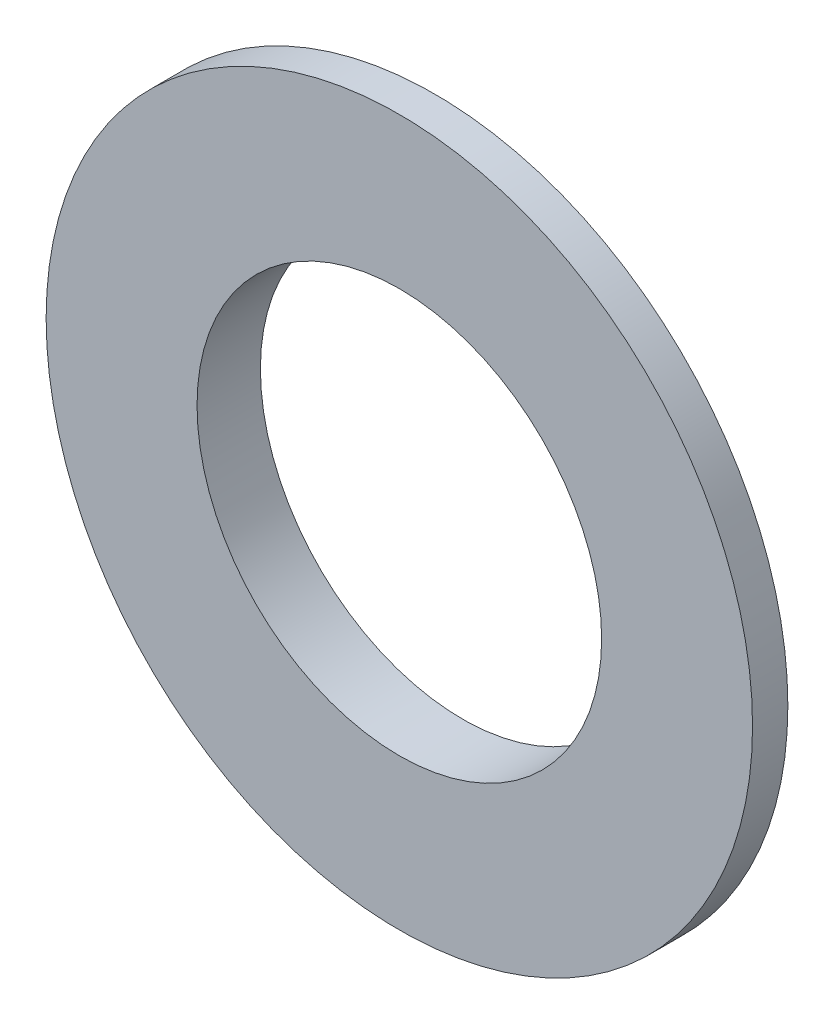
ISO-10303-21;
HEADER;
FILE_DESCRIPTION(('STEP AP214'),'2;1');
FILE_NAME('part.step','',(''),(''),'','','');
FILE_SCHEMA(('AUTOMOTIVE_DESIGN { 1 0 10303 214 1 1 1 1 }'));
ENDSEC;
DATA;
#1=APPLICATION_CONTEXT('core data for automotive mechanical design processes');
#2=APPLICATION_PROTOCOL_DEFINITION('international standard','automotive_design',2000,#1);
#3=PRODUCT_CONTEXT('',#1,'mechanical');
#4=PRODUCT('Part','Part','',(#3));
#5=PRODUCT_RELATED_PRODUCT_CATEGORY('part','',(#4));
#6=PRODUCT_DEFINITION_FORMATION('','',#4);
#7=PRODUCT_DEFINITION_CONTEXT('part definition',#1,'design');
#8=PRODUCT_DEFINITION('design','',#6,#7);
#9=PRODUCT_DEFINITION_SHAPE('','',#8);
#10=(LENGTH_UNIT() NAMED_UNIT(*) SI_UNIT(.MILLI.,.METRE.));
#11=(NAMED_UNIT(*) PLANE_ANGLE_UNIT() SI_UNIT($,.RADIAN.));
#12=(NAMED_UNIT(*) SI_UNIT($,.STERADIAN.) SOLID_ANGLE_UNIT());
#13=UNCERTAINTY_MEASURE_WITH_UNIT(LENGTH_MEASURE(1.E-05),#10,'distance_accuracy_value','');
#14=(GEOMETRIC_REPRESENTATION_CONTEXT(3) GLOBAL_UNCERTAINTY_ASSIGNED_CONTEXT((#13)) GLOBAL_UNIT_ASSIGNED_CONTEXT((#10,
#11,#12)) REPRESENTATION_CONTEXT('',''));
#15=CARTESIAN_POINT('',(0.,0.,0.));
#16=DIRECTION('',(0.,0.,1.));
#17=DIRECTION('',(1.,0.,0.));
#18=AXIS2_PLACEMENT_3D('',#15,#16,#17);
#19=CARTESIAN_POINT('',(0.,0.,2.));
#20=DIRECTION('',(0.,0.,-1.));
#21=DIRECTION('',(-1.,0.,0.));
#22=AXIS2_PLACEMENT_3D('',#19,#20,#21);
#23=CYLINDRICAL_SURFACE('',#22,11.455);
#24=CARTESIAN_POINT('',(0.,0.,2.));
#25=DIRECTION('',(0.,0.,1.));
#26=DIRECTION('',(1.,0.,0.));
#27=AXIS2_PLACEMENT_3D('',#24,#25,#26);
#28=CIRCLE('',#27,11.455);
#29=CARTESIAN_POINT('',(11.455,0.,2.));
#30=VERTEX_POINT('',#29);
#31=EDGE_CURVE('E48',#30,#30,#28,.T.);
#32=ORIENTED_EDGE('',*,*,#31,.T.);
#33=EDGE_LOOP('',(#32));
#34=FACE_BOUND('',#33,.T.);
#35=CARTESIAN_POINT('',(0.,0.,-1.5875));
#36=DIRECTION('',(0.,0.,-1.));
#37=DIRECTION('',(-1.,0.,0.));
#38=AXIS2_PLACEMENT_3D('',#35,#36,#37);
#39=CIRCLE('',#38,11.455);
#40=CARTESIAN_POINT('',(-11.455,0.,-1.5875));
#41=VERTEX_POINT('',#40);
#42=EDGE_CURVE('E61',#41,#41,#39,.F.);
#43=ORIENTED_EDGE('',*,*,#42,.F.);
#44=EDGE_LOOP('',(#43));
#45=FACE_BOUND('',#44,.T.);
#46=ADVANCED_FACE('F38',(#34,#45),#23,.F.);
#47=CARTESIAN_POINT('',(0.,0.,2.));
#48=DIRECTION('',(0.,0.,-1.));
#49=DIRECTION('',(-1.,0.,0.));
#50=AXIS2_PLACEMENT_3D('',#47,#48,#49);
#51=CYLINDRICAL_SURFACE('',#50,20.);
#52=CARTESIAN_POINT('',(0.,0.,2.));
#53=DIRECTION('',(0.,0.,1.));
#54=DIRECTION('',(1.,0.,0.));
#55=AXIS2_PLACEMENT_3D('',#52,#53,#54);
#56=CIRCLE('',#55,20.);
#57=CARTESIAN_POINT('',(20.,0.,2.));
#58=VERTEX_POINT('',#57);
#59=EDGE_CURVE('E44',#58,#58,#56,.T.);
#60=ORIENTED_EDGE('',*,*,#59,.F.);
#61=EDGE_LOOP('',(#60));
#62=FACE_BOUND('',#61,.T.);
#63=CARTESIAN_POINT('',(0.,0.,0.));
#64=DIRECTION('',(0.,0.,1.));
#65=DIRECTION('',(1.,0.,0.));
#66=AXIS2_PLACEMENT_3D('',#63,#64,#65);
#67=CIRCLE('',#66,20.);
#68=CARTESIAN_POINT('',(20.,0.,0.));
#69=VERTEX_POINT('',#68);
#70=EDGE_CURVE('E53',#69,#69,#67,.T.);
#71=ORIENTED_EDGE('',*,*,#70,.T.);
#72=EDGE_LOOP('',(#71));
#73=FACE_BOUND('',#72,.T.);
#74=ADVANCED_FACE('F71',(#62,#73),#51,.T.);
#75=CARTESIAN_POINT('',(0.,0.,2.));
#76=DIRECTION('',(0.,0.,1.));
#77=DIRECTION('',(1.,0.,0.));
#78=AXIS2_PLACEMENT_3D('',#75,#76,#77);
#79=PLANE('',#78);
#80=ORIENTED_EDGE('',*,*,#31,.F.);
#81=EDGE_LOOP('',(#80));
#82=FACE_BOUND('',#81,.T.);
#83=ORIENTED_EDGE('',*,*,#59,.T.);
#84=EDGE_LOOP('',(#83));
#85=FACE_BOUND('',#84,.T.);
#86=ADVANCED_FACE('F76',(#82,#85),#79,.T.);
#87=CARTESIAN_POINT('',(0.,0.,0.));
#88=DIRECTION('',(0.,0.,1.));
#89=DIRECTION('',(1.,0.,0.));
#90=AXIS2_PLACEMENT_3D('',#87,#88,#89);
#91=PLANE('',#90);
#92=CARTESIAN_POINT('',(0.,0.,0.));
#93=DIRECTION('',(0.,0.,1.));
#94=DIRECTION('',(1.,0.,0.));
#95=AXIS2_PLACEMENT_3D('',#92,#93,#94);
#96=CIRCLE('',#95,14.619);
#97=CARTESIAN_POINT('',(14.619,0.,0.));
#98=VERTEX_POINT('',#97);
#99=EDGE_CURVE('E10',#98,#98,#96,.F.);
#100=ORIENTED_EDGE('',*,*,#99,.F.);
#101=EDGE_LOOP('',(#100));
#102=FACE_BOUND('',#101,.T.);
#103=ORIENTED_EDGE('',*,*,#70,.F.);
#104=EDGE_LOOP('',(#103));
#105=FACE_BOUND('',#104,.T.);
#106=ADVANCED_FACE('F81',(#102,#105),#91,.F.);
#107=CARTESIAN_POINT('',(0.,0.,-1.5875));
#108=DIRECTION('',(0.,0.,1.));
#109=DIRECTION('',(1.,0.,0.));
#110=AXIS2_PLACEMENT_3D('',#107,#108,#109);
#111=CYLINDRICAL_SURFACE('',#110,14.619);
#112=CARTESIAN_POINT('',(0.,0.,-1.5875));
#113=DIRECTION('',(0.,0.,-1.));
#114=DIRECTION('',(-1.,0.,0.));
#115=AXIS2_PLACEMENT_3D('',#112,#113,#114);
#116=CIRCLE('',#115,14.619);
#117=CARTESIAN_POINT('',(-14.619,0.,-1.5875));
#118=VERTEX_POINT('',#117);
#119=EDGE_CURVE('E57',#118,#118,#116,.T.);
#120=ORIENTED_EDGE('',*,*,#119,.F.);
#121=EDGE_LOOP('',(#120));
#122=FACE_BOUND('',#121,.T.);
#123=ORIENTED_EDGE('',*,*,#99,.T.);
#124=EDGE_LOOP('',(#123));
#125=FACE_BOUND('',#124,.T.);
#126=ADVANCED_FACE('F86',(#122,#125),#111,.T.);
#127=CARTESIAN_POINT('',(0.,0.,-1.5875));
#128=DIRECTION('',(0.,0.,-1.));
#129=DIRECTION('',(-1.,0.,0.));
#130=AXIS2_PLACEMENT_3D('',#127,#128,#129);
#131=PLANE('',#130);
#132=ORIENTED_EDGE('',*,*,#42,.T.);
#133=EDGE_LOOP('',(#132));
#134=FACE_BOUND('',#133,.T.);
#135=ORIENTED_EDGE('',*,*,#119,.T.);
#136=EDGE_LOOP('',(#135));
#137=FACE_BOUND('',#136,.T.);
#138=ADVANCED_FACE('F68',(#134,#137),#131,.T.);
#139=CLOSED_SHELL('',(#46,#74,#86,#106,#126,#138));
#140=MANIFOLD_SOLID_BREP('B2',#139);
#141=ADVANCED_BREP_SHAPE_REPRESENTATION('',(#18,#140),#14);
#142=SHAPE_DEFINITION_REPRESENTATION(#9,#141);
ENDSEC;
END-ISO-10303-21;
